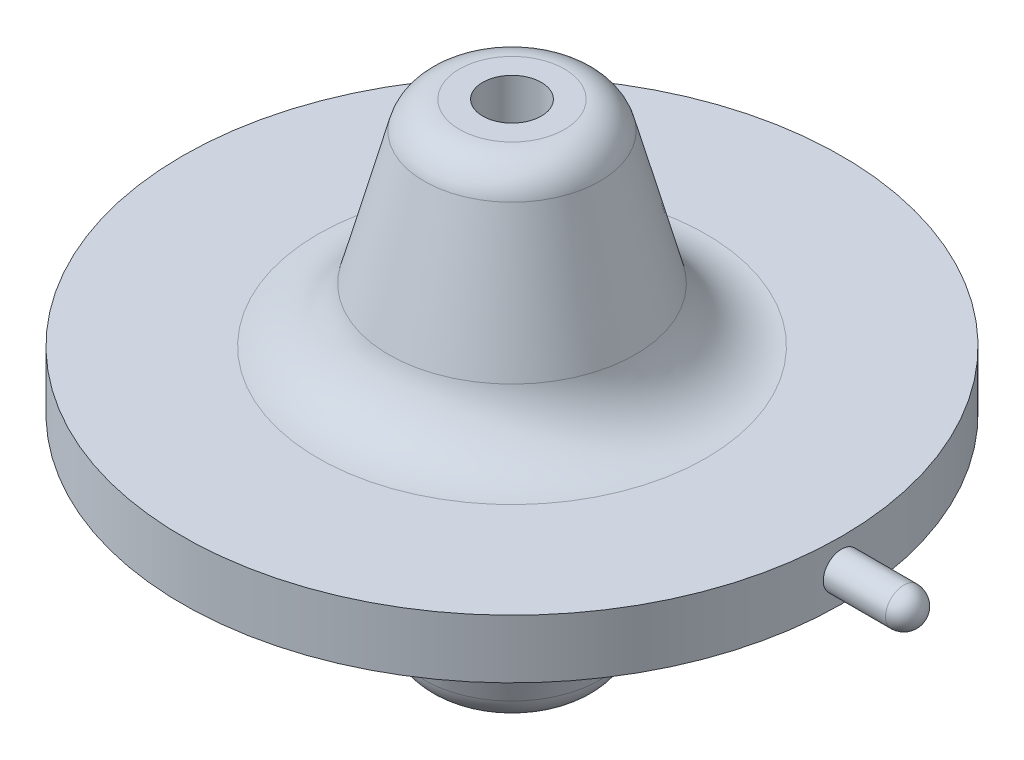
ISO-10303-21;
HEADER;
FILE_DESCRIPTION(('STEP AP214'),'2;1');
FILE_NAME('part.step','',(''),(''),'','','');
FILE_SCHEMA(('AUTOMOTIVE_DESIGN { 1 0 10303 214 1 1 1 1 }'));
ENDSEC;
DATA;
#1=APPLICATION_CONTEXT('core data for automotive mechanical design processes');
#2=APPLICATION_PROTOCOL_DEFINITION('international standard','automotive_design',2000,#1);
#3=PRODUCT_CONTEXT('',#1,'mechanical');
#4=PRODUCT('Part','Part','',(#3));
#5=PRODUCT_RELATED_PRODUCT_CATEGORY('part','',(#4));
#6=PRODUCT_DEFINITION_FORMATION('','',#4);
#7=PRODUCT_DEFINITION_CONTEXT('part definition',#1,'design');
#8=PRODUCT_DEFINITION('design','',#6,#7);
#9=PRODUCT_DEFINITION_SHAPE('','',#8);
#10=(LENGTH_UNIT() NAMED_UNIT(*) SI_UNIT(.MILLI.,.METRE.));
#11=(NAMED_UNIT(*) PLANE_ANGLE_UNIT() SI_UNIT($,.RADIAN.));
#12=(NAMED_UNIT(*) SI_UNIT($,.STERADIAN.) SOLID_ANGLE_UNIT());
#13=UNCERTAINTY_MEASURE_WITH_UNIT(LENGTH_MEASURE(1.E-05),#10,'distance_accuracy_value','');
#14=(GEOMETRIC_REPRESENTATION_CONTEXT(3) GLOBAL_UNCERTAINTY_ASSIGNED_CONTEXT((#13)) GLOBAL_UNIT_ASSIGNED_CONTEXT((#10,
#11,#12)) REPRESENTATION_CONTEXT('',''));
#15=CARTESIAN_POINT('',(0.,0.,0.));
#16=DIRECTION('',(0.,0.,1.));
#17=DIRECTION('',(1.,0.,0.));
#18=AXIS2_PLACEMENT_3D('',#15,#16,#17);
#19=CARTESIAN_POINT('',(53.5,0.,0.));
#20=DIRECTION('',(-1.,0.,0.));
#21=DIRECTION('',(0.,1.,0.));
#22=AXIS2_PLACEMENT_3D('',#19,#20,#21);
#23=SPHERICAL_SURFACE('',#22,2.5);
#24=CARTESIAN_POINT('',(53.5,0.,0.));
#25=DIRECTION('',(-1.,0.,0.));
#26=DIRECTION('',(0.,0.,1.));
#27=AXIS2_PLACEMENT_3D('',#24,#25,#26);
#28=CIRCLE('',#27,2.5);
#29=CARTESIAN_POINT('',(53.5,0.,2.5));
#30=VERTEX_POINT('',#29);
#31=EDGE_CURVE('E11',#30,#30,#28,.T.);
#32=ORIENTED_EDGE('',*,*,#31,.F.);
#33=EDGE_LOOP('',(#32));
#34=FACE_BOUND('',#33,.T.);
#35=ADVANCED_FACE('F45',(#34),#23,.T.);
#36=CARTESIAN_POINT('',(0.,0.,0.));
#37=DIRECTION('',(-1.,0.,0.));
#38=DIRECTION('',(0.,0.,1.));
#39=AXIS2_PLACEMENT_3D('',#36,#37,#38);
#40=CYLINDRICAL_SURFACE('',#39,2.5);
#41=CARTESIAN_POINT('',(45.,0.,0.));
#42=DIRECTION('',(-1.,0.,0.));
#43=DIRECTION('',(0.,0.,1.));
#44=AXIS2_PLACEMENT_3D('',#41,#42,#43);
#45=CIRCLE('',#44,2.5);
#46=CARTESIAN_POINT('',(45.,0.,2.5));
#47=VERTEX_POINT('',#46);
#48=EDGE_CURVE('E51',#47,#47,#45,.T.);
#49=ORIENTED_EDGE('',*,*,#48,.F.);
#50=EDGE_LOOP('',(#49));
#51=FACE_BOUND('',#50,.T.);
#52=ORIENTED_EDGE('',*,*,#31,.T.);
#53=EDGE_LOOP('',(#52));
#54=FACE_BOUND('',#53,.T.);
#55=ADVANCED_FACE('F59',(#51,#54),#40,.T.);
#56=CARTESIAN_POINT('',(45.,0.,0.));
#57=DIRECTION('',(1.,0.,0.));
#58=DIRECTION('',(0.,0.,-1.));
#59=AXIS2_PLACEMENT_3D('',#56,#57,#58);
#60=PLANE('',#59);
#61=ORIENTED_EDGE('',*,*,#48,.T.);
#62=EDGE_LOOP('',(#61));
#63=FACE_BOUND('',#62,.T.);
#64=ADVANCED_FACE('F57',(#63),#60,.F.);
#65=CLOSED_SHELL('',(#35,#55,#64));
#66=MANIFOLD_SOLID_BREP('B2',#65);
#67=CARTESIAN_POINT('',(0.,14.,0.));
#68=DIRECTION('',(0.,1.,0.));
#69=DIRECTION('',(-1.,0.,0.));
#70=AXIS2_PLACEMENT_3D('',#67,#68,#69);
#71=TOROIDAL_SURFACE('',#70,26.4973862987783,10.);
#72=CARTESIAN_POINT('',(0.,4.00000000000001,0.));
#73=DIRECTION('',(0.,1.,0.));
#74=DIRECTION('',(-1.,0.,0.));
#75=AXIS2_PLACEMENT_3D('',#72,#73,#74);
#76=CIRCLE('',#75,26.4973862987783);
#77=CARTESIAN_POINT('',(-26.4973862987783,4.,0.));
#78=VERTEX_POINT('',#77);
#79=EDGE_CURVE('E129',#78,#78,#76,.T.);
#80=ORIENTED_EDGE('',*,*,#79,.T.);
#81=EDGE_LOOP('',(#80));
#82=FACE_BOUND('',#81,.T.);
#83=CARTESIAN_POINT('',(0.,11.4118095489748,0.));
#84=DIRECTION('',(0.,1.,0.));
#85=DIRECTION('',(-1.,0.,0.));
#86=AXIS2_PLACEMENT_3D('',#83,#84,#85);
#87=CIRCLE('',#86,16.8381280358876);
#88=CARTESIAN_POINT('',(-16.8381280358876,11.4118095489748,0.));
#89=VERTEX_POINT('',#88);
#90=EDGE_CURVE('E44',#89,#89,#87,.T.);
#91=ORIENTED_EDGE('',*,*,#90,.F.);
#92=EDGE_LOOP('',(#91));
#93=FACE_BOUND('',#92,.T.);
#94=ADVANCED_FACE('F86',(#82,#93),#71,.F.);
#95=CARTESIAN_POINT('',(0.,29.4940952255126,0.));
#96=DIRECTION('',(0.,-1.,0.));
#97=DIRECTION('',(1.,0.,0.));
#98=AXIS2_PLACEMENT_3D('',#95,#96,#97);
#99=CONICAL_SURFACE('',#98,11.9929941915505,0.261799387799146);
#100=ORIENTED_EDGE('',*,*,#90,.T.);
#101=EDGE_LOOP('',(#100));
#102=FACE_BOUND('',#101,.T.);
#103=CARTESIAN_POINT('',(0.,29.4940952255126,0.));
#104=DIRECTION('',(0.,1.,0.));
#105=DIRECTION('',(-1.,0.,0.));
#106=AXIS2_PLACEMENT_3D('',#103,#104,#105);
#107=CIRCLE('',#106,11.9929941915505);
#108=CARTESIAN_POINT('',(-11.9929941915505,29.4940952255126,0.));
#109=VERTEX_POINT('',#108);
#110=EDGE_CURVE('E93',#109,#109,#107,.T.);
#111=ORIENTED_EDGE('',*,*,#110,.F.);
#112=EDGE_LOOP('',(#111));
#113=FACE_BOUND('',#112,.T.);
#114=ADVANCED_FACE('F160',(#102,#113),#99,.T.);
#115=CARTESIAN_POINT('',(0.,28.2,0.));
#116=DIRECTION('',(0.,1.,0.));
#117=DIRECTION('',(-1.,0.,0.));
#118=AXIS2_PLACEMENT_3D('',#115,#116,#117);
#119=TOROIDAL_SURFACE('',#118,7.16336506010519,5.);
#120=ORIENTED_EDGE('',*,*,#110,.T.);
#121=EDGE_LOOP('',(#120));
#122=FACE_BOUND('',#121,.T.);
#123=CARTESIAN_POINT('',(0.,33.2,0.));
#124=DIRECTION('',(0.,1.,0.));
#125=DIRECTION('',(-1.,0.,0.));
#126=AXIS2_PLACEMENT_3D('',#123,#124,#125);
#127=CIRCLE('',#126,7.16336506010519);
#128=CARTESIAN_POINT('',(-7.16336506010519,33.2,0.));
#129=VERTEX_POINT('',#128);
#130=EDGE_CURVE('E98',#129,#129,#127,.T.);
#131=ORIENTED_EDGE('',*,*,#130,.F.);
#132=EDGE_LOOP('',(#131));
#133=FACE_BOUND('',#132,.T.);
#134=ADVANCED_FACE('F155',(#122,#133),#119,.T.);
#135=CARTESIAN_POINT('',(0.,33.2,0.));
#136=DIRECTION('',(0.,1.,0.));
#137=DIRECTION('',(-1.,0.,0.));
#138=AXIS2_PLACEMENT_3D('',#135,#136,#137);
#139=PLANE('',#138);
#140=CARTESIAN_POINT('',(0.,33.2,0.));
#141=DIRECTION('',(0.,1.,0.));
#142=DIRECTION('',(0.,0.,1.));
#143=AXIS2_PLACEMENT_3D('',#140,#141,#142);
#144=CIRCLE('',#143,4.);
#145=CARTESIAN_POINT('',(0.,33.2,4.));
#146=VERTEX_POINT('',#145);
#147=EDGE_CURVE('E134',#146,#146,#144,.T.);
#148=ORIENTED_EDGE('',*,*,#147,.F.);
#149=EDGE_LOOP('',(#148));
#150=FACE_BOUND('',#149,.T.);
#151=ORIENTED_EDGE('',*,*,#130,.T.);
#152=EDGE_LOOP('',(#151));
#153=FACE_BOUND('',#152,.T.);
#154=ADVANCED_FACE('F152',(#150,#153),#139,.T.);
#155=CARTESIAN_POINT('',(0.,-33.2,0.));
#156=DIRECTION('',(0.,-1.,0.));
#157=DIRECTION('',(1.,0.,0.));
#158=AXIS2_PLACEMENT_3D('',#155,#156,#157);
#159=PLANE('',#158);
#160=CARTESIAN_POINT('',(0.,-33.2,0.));
#161=DIRECTION('',(0.,1.,0.));
#162=DIRECTION('',(0.,0.,1.));
#163=AXIS2_PLACEMENT_3D('',#160,#161,#162);
#164=CIRCLE('',#163,4.);
#165=CARTESIAN_POINT('',(0.,-33.2,4.));
#166=VERTEX_POINT('',#165);
#167=EDGE_CURVE('E133',#166,#166,#164,.T.);
#168=ORIENTED_EDGE('',*,*,#167,.T.);
#169=EDGE_LOOP('',(#168));
#170=FACE_BOUND('',#169,.T.);
#171=CARTESIAN_POINT('',(0.,-33.2,0.));
#172=DIRECTION('',(0.,1.,0.));
#173=DIRECTION('',(-1.,0.,0.));
#174=AXIS2_PLACEMENT_3D('',#171,#172,#173);
#175=CIRCLE('',#174,7.1633650601052);
#176=CARTESIAN_POINT('',(-7.16336506010519,-33.2,0.));
#177=VERTEX_POINT('',#176);
#178=EDGE_CURVE('E103',#177,#177,#175,.T.);
#179=ORIENTED_EDGE('',*,*,#178,.F.);
#180=EDGE_LOOP('',(#179));
#181=FACE_BOUND('',#180,.T.);
#182=ADVANCED_FACE('F142',(#170,#181),#159,.T.);
#183=CARTESIAN_POINT('',(0.,-28.2,0.));
#184=DIRECTION('',(0.,1.,0.));
#185=DIRECTION('',(-1.,0.,0.));
#186=AXIS2_PLACEMENT_3D('',#183,#184,#185);
#187=TOROIDAL_SURFACE('',#186,7.1633650601052,5.);
#188=ORIENTED_EDGE('',*,*,#178,.T.);
#189=EDGE_LOOP('',(#188));
#190=FACE_BOUND('',#189,.T.);
#191=CARTESIAN_POINT('',(0.,-29.4940952255126,0.));
#192=DIRECTION('',(0.,1.,0.));
#193=DIRECTION('',(-1.,0.,0.));
#194=AXIS2_PLACEMENT_3D('',#191,#192,#193);
#195=CIRCLE('',#194,11.9929941915505);
#196=CARTESIAN_POINT('',(-11.9929941915505,-29.4940952255126,0.));
#197=VERTEX_POINT('',#196);
#198=EDGE_CURVE('E109',#197,#197,#195,.T.);
#199=ORIENTED_EDGE('',*,*,#198,.F.);
#200=EDGE_LOOP('',(#199));
#201=FACE_BOUND('',#200,.T.);
#202=ADVANCED_FACE('F193',(#190,#201),#187,.T.);
#203=CARTESIAN_POINT('',(0.,-11.4118095489748,0.));
#204=DIRECTION('',(0.,1.,0.));
#205=DIRECTION('',(-1.,0.,0.));
#206=AXIS2_PLACEMENT_3D('',#203,#204,#205);
#207=CONICAL_SURFACE('',#206,16.8381280358876,0.261799387799146);
#208=ORIENTED_EDGE('',*,*,#198,.T.);
#209=EDGE_LOOP('',(#208));
#210=FACE_BOUND('',#209,.T.);
#211=CARTESIAN_POINT('',(0.,-11.4118095489748,0.));
#212=DIRECTION('',(0.,1.,0.));
#213=DIRECTION('',(-1.,0.,0.));
#214=AXIS2_PLACEMENT_3D('',#211,#212,#213);
#215=CIRCLE('',#214,16.8381280358876);
#216=CARTESIAN_POINT('',(-16.8381280358876,-11.4118095489748,0.));
#217=VERTEX_POINT('',#216);
#218=EDGE_CURVE('E113',#217,#217,#215,.T.);
#219=ORIENTED_EDGE('',*,*,#218,.F.);
#220=EDGE_LOOP('',(#219));
#221=FACE_BOUND('',#220,.T.);
#222=ADVANCED_FACE('F189',(#210,#221),#207,.T.);
#223=CARTESIAN_POINT('',(0.,-14.,0.));
#224=DIRECTION('',(0.,1.,0.));
#225=DIRECTION('',(-1.,0.,0.));
#226=AXIS2_PLACEMENT_3D('',#223,#224,#225);
#227=TOROIDAL_SURFACE('',#226,26.4973862987783,10.);
#228=ORIENTED_EDGE('',*,*,#218,.T.);
#229=EDGE_LOOP('',(#228));
#230=FACE_BOUND('',#229,.T.);
#231=CARTESIAN_POINT('',(0.,-4.,0.));
#232=DIRECTION('',(0.,1.,0.));
#233=DIRECTION('',(-1.,0.,0.));
#234=AXIS2_PLACEMENT_3D('',#231,#232,#233);
#235=CIRCLE('',#234,26.4973862987783);
#236=CARTESIAN_POINT('',(-26.4973862987783,-4.,0.));
#237=VERTEX_POINT('',#236);
#238=EDGE_CURVE('E117',#237,#237,#235,.T.);
#239=ORIENTED_EDGE('',*,*,#238,.F.);
#240=EDGE_LOOP('',(#239));
#241=FACE_BOUND('',#240,.T.);
#242=ADVANCED_FACE('F185',(#230,#241),#227,.F.);
#243=CARTESIAN_POINT('',(-26.4973862987783,-4.,0.));
#244=DIRECTION('',(0.,-1.,0.));
#245=DIRECTION('',(1.,0.,0.));
#246=AXIS2_PLACEMENT_3D('',#243,#244,#245);
#247=PLANE('',#246);
#248=ORIENTED_EDGE('',*,*,#238,.T.);
#249=EDGE_LOOP('',(#248));
#250=FACE_BOUND('',#249,.T.);
#251=CARTESIAN_POINT('',(0.,-4.,0.));
#252=DIRECTION('',(0.,1.,0.));
#253=DIRECTION('',(-1.,0.,0.));
#254=AXIS2_PLACEMENT_3D('',#251,#252,#253);
#255=CIRCLE('',#254,45.);
#256=CARTESIAN_POINT('',(-45.,-4.00000000000001,0.));
#257=VERTEX_POINT('',#256);
#258=EDGE_CURVE('E121',#257,#257,#255,.T.);
#259=ORIENTED_EDGE('',*,*,#258,.F.);
#260=EDGE_LOOP('',(#259));
#261=FACE_BOUND('',#260,.T.);
#262=ADVANCED_FACE('F179',(#250,#261),#247,.T.);
#263=CARTESIAN_POINT('',(0.,33.2,0.));
#264=DIRECTION('',(0.,1.,0.));
#265=DIRECTION('',(-1.,0.,0.));
#266=AXIS2_PLACEMENT_3D('',#263,#264,#265);
#267=CYLINDRICAL_SURFACE('',#266,45.);
#268=ORIENTED_EDGE('',*,*,#258,.T.);
#269=EDGE_LOOP('',(#268));
#270=FACE_BOUND('',#269,.T.);
#271=CARTESIAN_POINT('',(0.,4.00000000000001,0.));
#272=DIRECTION('',(0.,1.,0.));
#273=DIRECTION('',(-1.,0.,0.));
#274=AXIS2_PLACEMENT_3D('',#271,#272,#273);
#275=CIRCLE('',#274,45.);
#276=CARTESIAN_POINT('',(-45.,4.,0.));
#277=VERTEX_POINT('',#276);
#278=EDGE_CURVE('E125',#277,#277,#275,.T.);
#279=ORIENTED_EDGE('',*,*,#278,.F.);
#280=EDGE_LOOP('',(#279));
#281=FACE_BOUND('',#280,.T.);
#282=ADVANCED_FACE('F173',(#270,#281),#267,.T.);
#283=CARTESIAN_POINT('',(-26.4973862987783,4.,0.));
#284=DIRECTION('',(0.,1.,0.));
#285=DIRECTION('',(-1.,0.,0.));
#286=AXIS2_PLACEMENT_3D('',#283,#284,#285);
#287=PLANE('',#286);
#288=ORIENTED_EDGE('',*,*,#278,.T.);
#289=EDGE_LOOP('',(#288));
#290=FACE_BOUND('',#289,.T.);
#291=ORIENTED_EDGE('',*,*,#79,.F.);
#292=EDGE_LOOP('',(#291));
#293=FACE_BOUND('',#292,.T.);
#294=ADVANCED_FACE('F148',(#290,#293),#287,.T.);
#295=CARTESIAN_POINT('',(0.,-33.2,0.));
#296=DIRECTION('',(0.,1.,0.));
#297=DIRECTION('',(0.,0.,1.));
#298=AXIS2_PLACEMENT_3D('',#295,#296,#297);
#299=CYLINDRICAL_SURFACE('',#298,4.);
#300=ORIENTED_EDGE('',*,*,#167,.F.);
#301=EDGE_LOOP('',(#300));
#302=FACE_BOUND('',#301,.T.);
#303=ORIENTED_EDGE('',*,*,#147,.T.);
#304=EDGE_LOOP('',(#303));
#305=FACE_BOUND('',#304,.T.);
#306=ADVANCED_FACE('F145',(#302,#305),#299,.F.);
#307=CLOSED_SHELL('',(#94,#114,#134,#154,#182,#202,#222,#242,#262,#282,#294,#306));
#308=MANIFOLD_SOLID_BREP('B6',#307);
#309=ADVANCED_BREP_SHAPE_REPRESENTATION('',(#18,#66,#308),#14);
#310=SHAPE_DEFINITION_REPRESENTATION(#9,#309);
ENDSEC;
END-ISO-10303-21;
